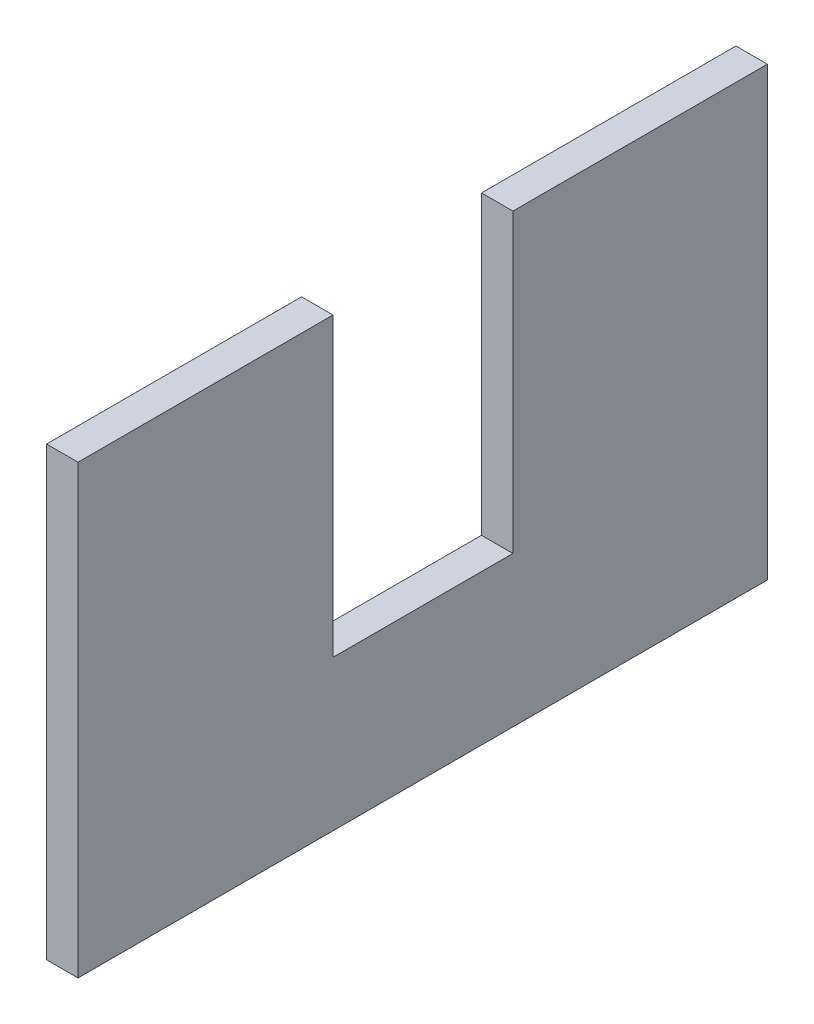
ISO-10303-21;
HEADER;
FILE_DESCRIPTION(('STEP AP214'),'2;1');
FILE_NAME('part.step','',(''),(''),'','','');
FILE_SCHEMA(('AUTOMOTIVE_DESIGN { 1 0 10303 214 1 1 1 1 }'));
ENDSEC;
DATA;
#1=APPLICATION_CONTEXT('core data for automotive mechanical design processes');
#2=APPLICATION_PROTOCOL_DEFINITION('international standard','automotive_design',2000,#1);
#3=PRODUCT_CONTEXT('',#1,'mechanical');
#4=PRODUCT('Part','Part','',(#3));
#5=PRODUCT_RELATED_PRODUCT_CATEGORY('part','',(#4));
#6=PRODUCT_DEFINITION_FORMATION('','',#4);
#7=PRODUCT_DEFINITION_CONTEXT('part definition',#1,'design');
#8=PRODUCT_DEFINITION('design','',#6,#7);
#9=PRODUCT_DEFINITION_SHAPE('','',#8);
#10=(LENGTH_UNIT() NAMED_UNIT(*) SI_UNIT(.MILLI.,.METRE.));
#11=(NAMED_UNIT(*) PLANE_ANGLE_UNIT() SI_UNIT($,.RADIAN.));
#12=(NAMED_UNIT(*) SI_UNIT($,.STERADIAN.) SOLID_ANGLE_UNIT());
#13=UNCERTAINTY_MEASURE_WITH_UNIT(LENGTH_MEASURE(1.E-05),#10,'distance_accuracy_value','');
#14=(GEOMETRIC_REPRESENTATION_CONTEXT(3) GLOBAL_UNCERTAINTY_ASSIGNED_CONTEXT((#13)) GLOBAL_UNIT_ASSIGNED_CONTEXT((#10,
#11,#12)) REPRESENTATION_CONTEXT('',''));
#15=CARTESIAN_POINT('',(0.,0.,0.));
#16=DIRECTION('',(0.,0.,1.));
#17=DIRECTION('',(1.,0.,0.));
#18=AXIS2_PLACEMENT_3D('',#15,#16,#17);
#19=CARTESIAN_POINT('',(5.,-25.6039823008849,40.5265486725664));
#20=DIRECTION('',(0.,0.,-1.));
#21=DIRECTION('',(-1.,0.,0.));
#22=AXIS2_PLACEMENT_3D('',#19,#20,#21);
#23=PLANE('',#22);
#24=DIRECTION('',(0.,-1.,0.));
#25=VECTOR('',#24,1.);
#26=CARTESIAN_POINT('',(0.,-25.6039823008849,40.5265486725664));
#27=LINE('',#26,#25);
#28=CARTESIAN_POINT('',(0.,45.396017699115,40.5265486725664));
#29=VERTEX_POINT('',#28);
#30=CARTESIAN_POINT('',(0.,-25.6039823008849,40.5265486725664));
#31=VERTEX_POINT('',#30);
#32=EDGE_CURVE('E130',#29,#31,#27,.T.);
#33=ORIENTED_EDGE('',*,*,#32,.T.);
#34=DIRECTION('',(-1.,0.,0.));
#35=VECTOR('',#34,1.);
#36=CARTESIAN_POINT('',(5.,-25.6039823008849,40.5265486725664));
#37=LINE('',#36,#35);
#38=CARTESIAN_POINT('',(5.,-25.6039823008849,40.5265486725664));
#39=VERTEX_POINT('',#38);
#40=EDGE_CURVE('E11',#39,#31,#37,.T.);
#41=ORIENTED_EDGE('',*,*,#40,.F.);
#42=DIRECTION('',(0.,-1.,0.));
#43=VECTOR('',#42,1.);
#44=CARTESIAN_POINT('',(5.,-25.6039823008849,40.5265486725664));
#45=LINE('',#44,#43);
#46=CARTESIAN_POINT('',(5.,45.396017699115,40.5265486725664));
#47=VERTEX_POINT('',#46);
#48=EDGE_CURVE('E144',#47,#39,#45,.T.);
#49=ORIENTED_EDGE('',*,*,#48,.F.);
#50=DIRECTION('',(-1.,0.,0.));
#51=VECTOR('',#50,1.);
#52=CARTESIAN_POINT('',(5.,45.396017699115,40.5265486725664));
#53=LINE('',#52,#51);
#54=EDGE_CURVE('E126',#47,#29,#53,.T.);
#55=ORIENTED_EDGE('',*,*,#54,.T.);
#56=EDGE_LOOP('',(#33,#41,#49,#55));
#57=FACE_BOUND('',#56,.T.);
#58=ADVANCED_FACE('F34',(#57),#23,.F.);
#59=CARTESIAN_POINT('',(5.,-25.6039823008849,40.5265486725664));
#60=DIRECTION('',(0.,1.,0.));
#61=DIRECTION('',(0.,0.,1.));
#62=AXIS2_PLACEMENT_3D('',#59,#60,#61);
#63=PLANE('',#62);
#64=DIRECTION('',(0.,0.,-1.));
#65=VECTOR('',#64,1.);
#66=CARTESIAN_POINT('',(0.,-25.6039823008849,40.5265486725664));
#67=LINE('',#66,#65);
#68=CARTESIAN_POINT('',(0.,-25.6039823008849,-69.0419469274336));
#69=VERTEX_POINT('',#68);
#70=EDGE_CURVE('E133',#31,#69,#67,.T.);
#71=ORIENTED_EDGE('',*,*,#70,.T.);
#72=DIRECTION('',(-1.,0.,0.));
#73=VECTOR('',#72,1.);
#74=CARTESIAN_POINT('',(5.,-25.6039823008849,-69.0419469274336));
#75=LINE('',#74,#73);
#76=CARTESIAN_POINT('',(5.,-25.6039823008849,-69.0419469274336));
#77=VERTEX_POINT('',#76);
#78=EDGE_CURVE('E42',#77,#69,#75,.T.);
#79=ORIENTED_EDGE('',*,*,#78,.F.);
#80=DIRECTION('',(0.,0.,-1.));
#81=VECTOR('',#80,1.);
#82=CARTESIAN_POINT('',(5.,-25.6039823008849,40.5265486725664));
#83=LINE('',#82,#81);
#84=EDGE_CURVE('E93',#39,#77,#83,.T.);
#85=ORIENTED_EDGE('',*,*,#84,.F.);
#86=ORIENTED_EDGE('',*,*,#40,.T.);
#87=EDGE_LOOP('',(#71,#79,#85,#86));
#88=FACE_BOUND('',#87,.T.);
#89=ADVANCED_FACE('F179',(#88),#63,.F.);
#90=CARTESIAN_POINT('',(5.,-25.6039823008849,-69.0419469274336));
#91=DIRECTION('',(0.,0.,1.));
#92=DIRECTION('',(1.,0.,0.));
#93=AXIS2_PLACEMENT_3D('',#90,#91,#92);
#94=PLANE('',#93);
#95=DIRECTION('',(0.,1.,0.));
#96=VECTOR('',#95,1.);
#97=CARTESIAN_POINT('',(0.,-25.6039823008849,-69.0419469274336));
#98=LINE('',#97,#96);
#99=CARTESIAN_POINT('',(0.,45.396017699115,-69.0419469274336));
#100=VERTEX_POINT('',#99);
#101=EDGE_CURVE('E135',#69,#100,#98,.T.);
#102=ORIENTED_EDGE('',*,*,#101,.T.);
#103=DIRECTION('',(-1.,0.,0.));
#104=VECTOR('',#103,1.);
#105=CARTESIAN_POINT('',(5.,45.396017699115,-69.0419469274336));
#106=LINE('',#105,#104);
#107=CARTESIAN_POINT('',(5.,45.396017699115,-69.0419469274336));
#108=VERTEX_POINT('',#107);
#109=EDGE_CURVE('E151',#108,#100,#106,.T.);
#110=ORIENTED_EDGE('',*,*,#109,.F.);
#111=DIRECTION('',(0.,1.,0.));
#112=VECTOR('',#111,1.);
#113=CARTESIAN_POINT('',(5.,-25.6039823008849,-69.0419469274336));
#114=LINE('',#113,#112);
#115=EDGE_CURVE('E159',#77,#108,#114,.T.);
#116=ORIENTED_EDGE('',*,*,#115,.F.);
#117=ORIENTED_EDGE('',*,*,#78,.T.);
#118=EDGE_LOOP('',(#102,#110,#116,#117));
#119=FACE_BOUND('',#118,.T.);
#120=ADVANCED_FACE('F157',(#119),#94,.F.);
#121=CARTESIAN_POINT('',(5.,45.396017699115,-28.5917503195779));
#122=DIRECTION('',(0.,-1.,0.));
#123=DIRECTION('',(0.,0.,-1.));
#124=AXIS2_PLACEMENT_3D('',#121,#122,#123);
#125=PLANE('',#124);
#126=DIRECTION('',(0.,0.,1.));
#127=VECTOR('',#126,1.);
#128=CARTESIAN_POINT('',(0.,45.396017699115,-28.5917503195779));
#129=LINE('',#128,#127);
#130=CARTESIAN_POINT('',(0.,45.396017699115,-28.5917503195779));
#131=VERTEX_POINT('',#130);
#132=EDGE_CURVE('E137',#100,#131,#129,.T.);
#133=ORIENTED_EDGE('',*,*,#132,.T.);
#134=DIRECTION('',(-1.,0.,0.));
#135=VECTOR('',#134,1.);
#136=CARTESIAN_POINT('',(5.,45.396017699115,-28.5917503195779));
#137=LINE('',#136,#135);
#138=CARTESIAN_POINT('',(5.,45.396017699115,-28.5917503195779));
#139=VERTEX_POINT('',#138);
#140=EDGE_CURVE('E148',#139,#131,#137,.T.);
#141=ORIENTED_EDGE('',*,*,#140,.F.);
#142=DIRECTION('',(0.,0.,1.));
#143=VECTOR('',#142,1.);
#144=CARTESIAN_POINT('',(5.,45.396017699115,-28.5917503195779));
#145=LINE('',#144,#143);
#146=EDGE_CURVE('E171',#108,#139,#145,.T.);
#147=ORIENTED_EDGE('',*,*,#146,.F.);
#148=ORIENTED_EDGE('',*,*,#109,.T.);
#149=EDGE_LOOP('',(#133,#141,#147,#148));
#150=FACE_BOUND('',#149,.T.);
#151=ADVANCED_FACE('F167',(#150),#125,.F.);
#152=CARTESIAN_POINT('',(5.,45.396017699115,-28.5917503195779));
#153=DIRECTION('',(0.,0.,-1.));
#154=DIRECTION('',(-1.,0.,0.));
#155=AXIS2_PLACEMENT_3D('',#152,#153,#154);
#156=PLANE('',#155);
#157=DIRECTION('',(0.,-1.,0.));
#158=VECTOR('',#157,1.);
#159=CARTESIAN_POINT('',(0.,45.396017699115,-28.5917503195779));
#160=LINE('',#159,#158);
#161=CARTESIAN_POINT('',(0.,-1.72641889491607,-28.5917503195779));
#162=VERTEX_POINT('',#161);
#163=EDGE_CURVE('E139',#131,#162,#160,.T.);
#164=ORIENTED_EDGE('',*,*,#163,.T.);
#165=DIRECTION('',(-1.,0.,0.));
#166=VECTOR('',#165,1.);
#167=CARTESIAN_POINT('',(5.,-1.72641889491607,-28.5917503195779));
#168=LINE('',#167,#166);
#169=CARTESIAN_POINT('',(5.,-1.72641889491607,-28.5917503195779));
#170=VERTEX_POINT('',#169);
#171=EDGE_CURVE('E121',#170,#162,#168,.T.);
#172=ORIENTED_EDGE('',*,*,#171,.F.);
#173=DIRECTION('',(0.,-1.,0.));
#174=VECTOR('',#173,1.);
#175=CARTESIAN_POINT('',(5.,45.396017699115,-28.5917503195779));
#176=LINE('',#175,#174);
#177=EDGE_CURVE('E112',#139,#170,#176,.T.);
#178=ORIENTED_EDGE('',*,*,#177,.F.);
#179=ORIENTED_EDGE('',*,*,#140,.T.);
#180=EDGE_LOOP('',(#164,#172,#178,#179));
#181=FACE_BOUND('',#180,.T.);
#182=ADVANCED_FACE('F170',(#181),#156,.F.);
#183=CARTESIAN_POINT('',(5.,-1.72641889491607,0.));
#184=DIRECTION('',(0.,-1.,0.));
#185=DIRECTION('',(0.,0.,-1.));
#186=AXIS2_PLACEMENT_3D('',#183,#184,#185);
#187=PLANE('',#186);
#188=DIRECTION('',(0.,0.,1.));
#189=VECTOR('',#188,1.);
#190=CARTESIAN_POINT('',(0.,-1.72641889491607,0.));
#191=LINE('',#190,#189);
#192=CARTESIAN_POINT('',(0.,-1.72641889491607,0.));
#193=VERTEX_POINT('',#192);
#194=EDGE_CURVE('E120',#162,#193,#191,.T.);
#195=ORIENTED_EDGE('',*,*,#194,.T.);
#196=DIRECTION('',(-1.,0.,0.));
#197=VECTOR('',#196,1.);
#198=CARTESIAN_POINT('',(5.,-1.72641889491607,0.));
#199=LINE('',#198,#197);
#200=CARTESIAN_POINT('',(5.,-1.72641889491607,0.));
#201=VERTEX_POINT('',#200);
#202=EDGE_CURVE('E117',#201,#193,#199,.T.);
#203=ORIENTED_EDGE('',*,*,#202,.F.);
#204=DIRECTION('',(0.,0.,1.));
#205=VECTOR('',#204,1.);
#206=CARTESIAN_POINT('',(5.,-1.72641889491607,0.));
#207=LINE('',#206,#205);
#208=EDGE_CURVE('E106',#170,#201,#207,.T.);
#209=ORIENTED_EDGE('',*,*,#208,.F.);
#210=ORIENTED_EDGE('',*,*,#171,.T.);
#211=EDGE_LOOP('',(#195,#203,#209,#210));
#212=FACE_BOUND('',#211,.T.);
#213=ADVANCED_FACE('F118',(#212),#187,.F.);
#214=CARTESIAN_POINT('',(5.,45.396017699115,0.));
#215=DIRECTION('',(0.,0.,1.));
#216=DIRECTION('',(1.,0.,0.));
#217=AXIS2_PLACEMENT_3D('',#214,#215,#216);
#218=PLANE('',#217);
#219=DIRECTION('',(0.,1.,0.));
#220=VECTOR('',#219,1.);
#221=CARTESIAN_POINT('',(0.,45.396017699115,0.));
#222=LINE('',#221,#220);
#223=CARTESIAN_POINT('',(0.,45.396017699115,0.));
#224=VERTEX_POINT('',#223);
#225=EDGE_CURVE('E79',#193,#224,#222,.T.);
#226=ORIENTED_EDGE('',*,*,#225,.T.);
#227=DIRECTION('',(-1.,0.,0.));
#228=VECTOR('',#227,1.);
#229=CARTESIAN_POINT('',(5.,45.396017699115,0.));
#230=LINE('',#229,#228);
#231=CARTESIAN_POINT('',(5.,45.396017699115,0.));
#232=VERTEX_POINT('',#231);
#233=EDGE_CURVE('E122',#232,#224,#230,.T.);
#234=ORIENTED_EDGE('',*,*,#233,.F.);
#235=DIRECTION('',(0.,1.,0.));
#236=VECTOR('',#235,1.);
#237=CARTESIAN_POINT('',(5.,45.396017699115,0.));
#238=LINE('',#237,#236);
#239=EDGE_CURVE('E110',#201,#232,#238,.T.);
#240=ORIENTED_EDGE('',*,*,#239,.F.);
#241=ORIENTED_EDGE('',*,*,#202,.T.);
#242=EDGE_LOOP('',(#226,#234,#240,#241));
#243=FACE_BOUND('',#242,.T.);
#244=ADVANCED_FACE('F124',(#243),#218,.F.);
#245=CARTESIAN_POINT('',(5.,45.396017699115,40.5265486725664));
#246=DIRECTION('',(0.,-1.,0.));
#247=DIRECTION('',(0.,0.,-1.));
#248=AXIS2_PLACEMENT_3D('',#245,#246,#247);
#249=PLANE('',#248);
#250=DIRECTION('',(0.,0.,1.));
#251=VECTOR('',#250,1.);
#252=CARTESIAN_POINT('',(0.,45.396017699115,40.5265486725664));
#253=LINE('',#252,#251);
#254=EDGE_CURVE('E85',#224,#29,#253,.T.);
#255=ORIENTED_EDGE('',*,*,#254,.T.);
#256=ORIENTED_EDGE('',*,*,#54,.F.);
#257=DIRECTION('',(0.,0.,1.));
#258=VECTOR('',#257,1.);
#259=CARTESIAN_POINT('',(5.,45.396017699115,40.5265486725664));
#260=LINE('',#259,#258);
#261=EDGE_CURVE('E50',#232,#47,#260,.T.);
#262=ORIENTED_EDGE('',*,*,#261,.F.);
#263=ORIENTED_EDGE('',*,*,#233,.T.);
#264=EDGE_LOOP('',(#255,#256,#262,#263));
#265=FACE_BOUND('',#264,.T.);
#266=ADVANCED_FACE('F195',(#265),#249,.F.);
#267=CARTESIAN_POINT('',(5.,0.,0.));
#268=DIRECTION('',(-1.,0.,0.));
#269=DIRECTION('',(0.,0.,1.));
#270=AXIS2_PLACEMENT_3D('',#267,#268,#269);
#271=PLANE('',#270);
#272=ORIENTED_EDGE('',*,*,#48,.T.);
#273=ORIENTED_EDGE('',*,*,#84,.T.);
#274=ORIENTED_EDGE('',*,*,#115,.T.);
#275=ORIENTED_EDGE('',*,*,#146,.T.);
#276=ORIENTED_EDGE('',*,*,#177,.T.);
#277=ORIENTED_EDGE('',*,*,#208,.T.);
#278=ORIENTED_EDGE('',*,*,#239,.T.);
#279=ORIENTED_EDGE('',*,*,#261,.T.);
#280=EDGE_LOOP('',(#272,#273,#274,#275,#276,#277,#278,#279));
#281=FACE_BOUND('',#280,.T.);
#282=ADVANCED_FACE('F108',(#281),#271,.F.);
#283=CARTESIAN_POINT('',(0.,0.,0.));
#284=DIRECTION('',(-1.,0.,0.));
#285=DIRECTION('',(0.,0.,1.));
#286=AXIS2_PLACEMENT_3D('',#283,#284,#285);
#287=PLANE('',#286);
#288=ORIENTED_EDGE('',*,*,#32,.F.);
#289=ORIENTED_EDGE('',*,*,#254,.F.);
#290=ORIENTED_EDGE('',*,*,#225,.F.);
#291=ORIENTED_EDGE('',*,*,#194,.F.);
#292=ORIENTED_EDGE('',*,*,#163,.F.);
#293=ORIENTED_EDGE('',*,*,#132,.F.);
#294=ORIENTED_EDGE('',*,*,#101,.F.);
#295=ORIENTED_EDGE('',*,*,#70,.F.);
#296=EDGE_LOOP('',(#288,#289,#290,#291,#292,#293,#294,#295));
#297=FACE_BOUND('',#296,.T.);
#298=ADVANCED_FACE('F163',(#297),#287,.T.);
#299=CLOSED_SHELL('',(#58,#89,#120,#151,#182,#213,#244,#266,#282,#298));
#300=MANIFOLD_SOLID_BREP('B2',#299);
#301=ADVANCED_BREP_SHAPE_REPRESENTATION('',(#18,#300),#14);
#302=SHAPE_DEFINITION_REPRESENTATION(#9,#301);
ENDSEC;
END-ISO-10303-21;
